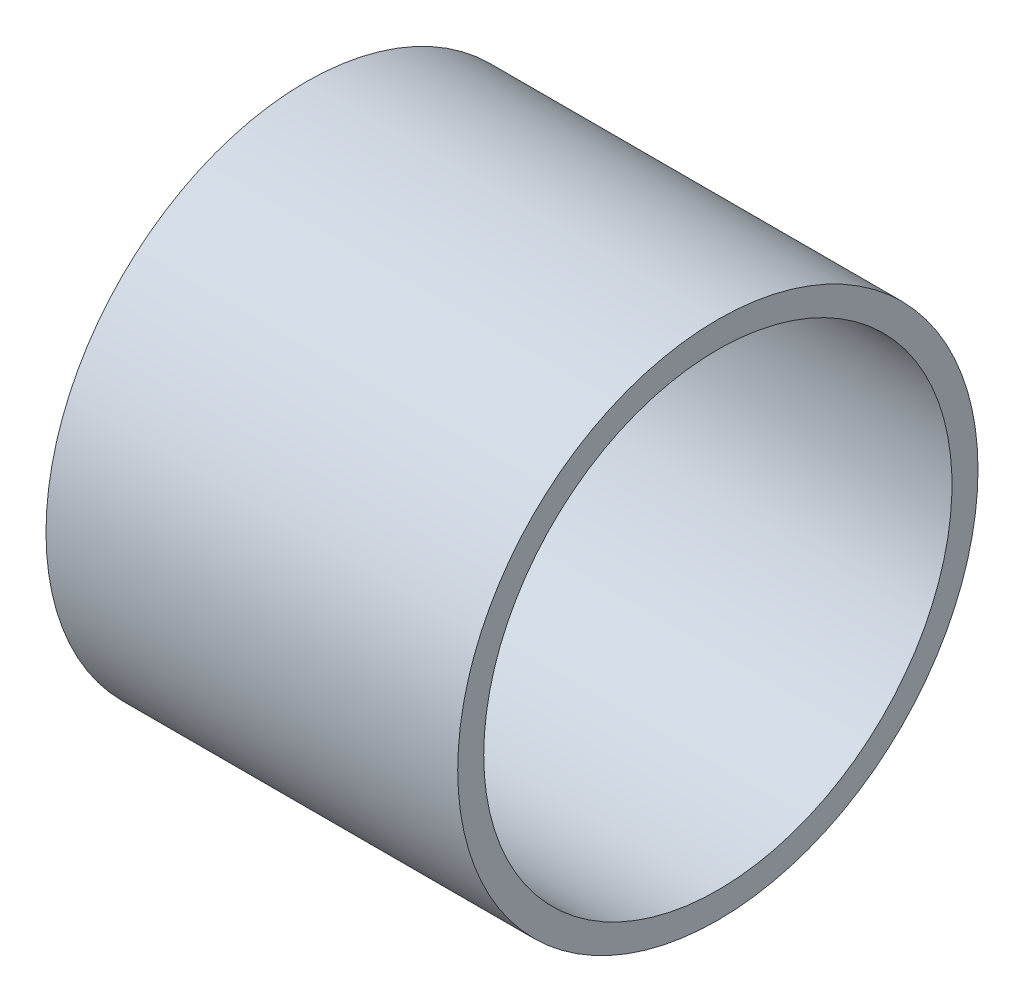
ISO-10303-21;
HEADER;
FILE_DESCRIPTION(('STEP AP214'),'2;1');
FILE_NAME('part.step','',(''),(''),'','','');
FILE_SCHEMA(('AUTOMOTIVE_DESIGN { 1 0 10303 214 1 1 1 1 }'));
ENDSEC;
DATA;
#1=APPLICATION_CONTEXT('core data for automotive mechanical design processes');
#2=APPLICATION_PROTOCOL_DEFINITION('international standard','automotive_design',2000,#1);
#3=PRODUCT_CONTEXT('',#1,'mechanical');
#4=PRODUCT('Part','Part','',(#3));
#5=PRODUCT_RELATED_PRODUCT_CATEGORY('part','',(#4));
#6=PRODUCT_DEFINITION_FORMATION('','',#4);
#7=PRODUCT_DEFINITION_CONTEXT('part definition',#1,'design');
#8=PRODUCT_DEFINITION('design','',#6,#7);
#9=PRODUCT_DEFINITION_SHAPE('','',#8);
#10=(LENGTH_UNIT() NAMED_UNIT(*) SI_UNIT(.MILLI.,.METRE.));
#11=(NAMED_UNIT(*) PLANE_ANGLE_UNIT() SI_UNIT($,.RADIAN.));
#12=(NAMED_UNIT(*) SI_UNIT($,.STERADIAN.) SOLID_ANGLE_UNIT());
#13=UNCERTAINTY_MEASURE_WITH_UNIT(LENGTH_MEASURE(1.E-05),#10,'distance_accuracy_value','');
#14=(GEOMETRIC_REPRESENTATION_CONTEXT(3) GLOBAL_UNCERTAINTY_ASSIGNED_CONTEXT((#13)) GLOBAL_UNIT_ASSIGNED_CONTEXT((#10,
#11,#12)) REPRESENTATION_CONTEXT('',''));
#15=CARTESIAN_POINT('',(0.,0.,0.));
#16=DIRECTION('',(0.,0.,1.));
#17=DIRECTION('',(1.,0.,0.));
#18=AXIS2_PLACEMENT_3D('',#15,#16,#17);
#19=CARTESIAN_POINT('',(140.019255902,0.,0.));
#20=DIRECTION('',(-1.,0.,0.));
#21=DIRECTION('',(0.,0.,1.));
#22=AXIS2_PLACEMENT_3D('',#19,#20,#21);
#23=CYLINDRICAL_SURFACE('',#22,15.875);
#24=CARTESIAN_POINT('',(-140.019255902,0.,0.));
#25=DIRECTION('',(1.,0.,0.));
#26=DIRECTION('',(0.,0.,-1.));
#27=AXIS2_PLACEMENT_3D('',#24,#25,#26);
#28=CIRCLE('',#27,15.875);
#29=CARTESIAN_POINT('',(-140.019255902,0.,-15.875));
#30=VERTEX_POINT('',#29);
#31=EDGE_CURVE('E10',#30,#30,#28,.T.);
#32=ORIENTED_EDGE('',*,*,#31,.T.);
#33=EDGE_LOOP('',(#32));
#34=FACE_BOUND('',#33,.T.);
#35=CARTESIAN_POINT('',(-114.895310976,0.,0.));
#36=DIRECTION('',(-1.,0.,0.));
#37=DIRECTION('',(0.,0.,1.));
#38=AXIS2_PLACEMENT_3D('',#35,#36,#37);
#39=CIRCLE('',#38,15.875);
#40=CARTESIAN_POINT('',(-114.895310976,0.,15.875));
#41=VERTEX_POINT('',#40);
#42=EDGE_CURVE('E57',#41,#41,#39,.T.);
#43=ORIENTED_EDGE('',*,*,#42,.T.);
#44=EDGE_LOOP('',(#43));
#45=FACE_BOUND('',#44,.T.);
#46=ADVANCED_FACE('F42',(#34,#45),#23,.T.);
#47=CARTESIAN_POINT('',(-140.019255902,0.,0.));
#48=DIRECTION('',(1.,0.,0.));
#49=DIRECTION('',(0.,0.,-1.));
#50=AXIS2_PLACEMENT_3D('',#47,#48,#49);
#51=PLANE('',#50);
#52=ORIENTED_EDGE('',*,*,#31,.F.);
#53=EDGE_LOOP('',(#52));
#54=FACE_BOUND('',#53,.T.);
#55=CARTESIAN_POINT('',(-140.019255902,0.,0.));
#56=DIRECTION('',(1.,0.,0.));
#57=DIRECTION('',(0.,0.,-1.));
#58=AXIS2_PLACEMENT_3D('',#55,#56,#57);
#59=CIRCLE('',#58,14.2875);
#60=CARTESIAN_POINT('',(-140.019255902,0.,-14.2875));
#61=VERTEX_POINT('',#60);
#62=EDGE_CURVE('E50',#61,#61,#59,.T.);
#63=ORIENTED_EDGE('',*,*,#62,.T.);
#64=EDGE_LOOP('',(#63));
#65=FACE_BOUND('',#64,.T.);
#66=ADVANCED_FACE('F78',(#54,#65),#51,.F.);
#67=CARTESIAN_POINT('',(140.019255902,0.,0.));
#68=DIRECTION('',(-1.,0.,0.));
#69=DIRECTION('',(0.,0.,1.));
#70=AXIS2_PLACEMENT_3D('',#67,#68,#69);
#71=CYLINDRICAL_SURFACE('',#70,14.2875);
#72=CARTESIAN_POINT('',(-114.895310976,0.,0.));
#73=DIRECTION('',(-1.,0.,0.));
#74=DIRECTION('',(0.,0.,1.));
#75=AXIS2_PLACEMENT_3D('',#72,#73,#74);
#76=CIRCLE('',#75,14.2875);
#77=CARTESIAN_POINT('',(-114.895310976,0.,14.2875));
#78=VERTEX_POINT('',#77);
#79=EDGE_CURVE('E45',#78,#78,#76,.T.);
#80=ORIENTED_EDGE('',*,*,#79,.F.);
#81=EDGE_LOOP('',(#80));
#82=FACE_BOUND('',#81,.T.);
#83=ORIENTED_EDGE('',*,*,#62,.F.);
#84=EDGE_LOOP('',(#83));
#85=FACE_BOUND('',#84,.T.);
#86=ADVANCED_FACE('F75',(#82,#85),#71,.F.);
#87=CARTESIAN_POINT('',(-114.895310976,-15.875,-15.875));
#88=DIRECTION('',(-1.,0.,0.));
#89=DIRECTION('',(0.,0.,1.));
#90=AXIS2_PLACEMENT_3D('',#87,#88,#89);
#91=PLANE('',#90);
#92=ORIENTED_EDGE('',*,*,#79,.T.);
#93=EDGE_LOOP('',(#92));
#94=FACE_BOUND('',#93,.T.);
#95=ORIENTED_EDGE('',*,*,#42,.F.);
#96=EDGE_LOOP('',(#95));
#97=FACE_BOUND('',#96,.T.);
#98=ADVANCED_FACE('F72',(#94,#97),#91,.F.);
#99=CLOSED_SHELL('',(#46,#66,#86,#98));
#100=MANIFOLD_SOLID_BREP('B2',#99);
#101=ADVANCED_BREP_SHAPE_REPRESENTATION('',(#18,#100),#14);
#102=SHAPE_DEFINITION_REPRESENTATION(#9,#101);
ENDSEC;
END-ISO-10303-21;
